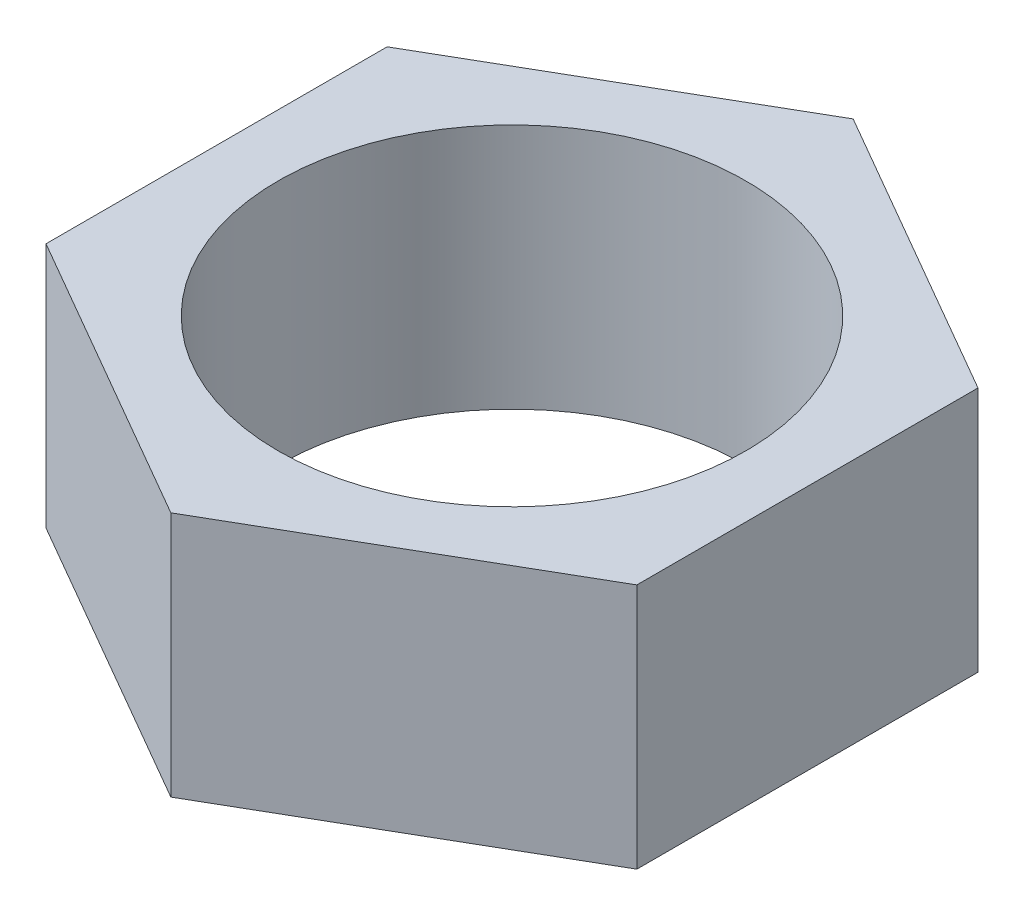
ISO-10303-21;
HEADER;
FILE_DESCRIPTION(('STEP AP214'),'2;1');
FILE_NAME('part.step','',(''),(''),'','','');
FILE_SCHEMA(('AUTOMOTIVE_DESIGN { 1 0 10303 214 1 1 1 1 }'));
ENDSEC;
DATA;
#1=APPLICATION_CONTEXT('core data for automotive mechanical design processes');
#2=APPLICATION_PROTOCOL_DEFINITION('international standard','automotive_design',2000,#1);
#3=PRODUCT_CONTEXT('',#1,'mechanical');
#4=PRODUCT('Part','Part','',(#3));
#5=PRODUCT_RELATED_PRODUCT_CATEGORY('part','',(#4));
#6=PRODUCT_DEFINITION_FORMATION('','',#4);
#7=PRODUCT_DEFINITION_CONTEXT('part definition',#1,'design');
#8=PRODUCT_DEFINITION('design','',#6,#7);
#9=PRODUCT_DEFINITION_SHAPE('','',#8);
#10=(LENGTH_UNIT() NAMED_UNIT(*) SI_UNIT(.MILLI.,.METRE.));
#11=(NAMED_UNIT(*) PLANE_ANGLE_UNIT() SI_UNIT($,.RADIAN.));
#12=(NAMED_UNIT(*) SI_UNIT($,.STERADIAN.) SOLID_ANGLE_UNIT());
#13=UNCERTAINTY_MEASURE_WITH_UNIT(LENGTH_MEASURE(1.E-05),#10,'distance_accuracy_value','');
#14=(GEOMETRIC_REPRESENTATION_CONTEXT(3) GLOBAL_UNCERTAINTY_ASSIGNED_CONTEXT((#13)) GLOBAL_UNIT_ASSIGNED_CONTEXT((#10,
#11,#12)) REPRESENTATION_CONTEXT('',''));
#15=CARTESIAN_POINT('',(0.,0.,0.));
#16=DIRECTION('',(0.,0.,1.));
#17=DIRECTION('',(1.,0.,0.));
#18=AXIS2_PLACEMENT_3D('',#15,#16,#17);
#19=CARTESIAN_POINT('',(0.,2.54,0.));
#20=DIRECTION('',(0.,1.,0.));
#21=DIRECTION('',(0.,0.,1.));
#22=AXIS2_PLACEMENT_3D('',#19,#20,#21);
#23=PLANE('',#22);
#24=DIRECTION('',(-0.866025403784438,0.,0.5));
#25=VECTOR('',#24,1.);
#26=CARTESIAN_POINT('',(0.,2.54,-3.51952724097996));
#27=LINE('',#26,#25);
#28=CARTESIAN_POINT('',(0.,2.54,-3.51952724097996));
#29=VERTEX_POINT('',#28);
#30=CARTESIAN_POINT('',(-3.048,2.54,-1.75976362048998));
#31=VERTEX_POINT('',#30);
#32=EDGE_CURVE('E129',#29,#31,#27,.T.);
#33=ORIENTED_EDGE('',*,*,#32,.T.);
#34=DIRECTION('',(0.,0.,1.));
#35=VECTOR('',#34,1.);
#36=CARTESIAN_POINT('',(-3.048,2.54,-1.75976362048998));
#37=LINE('',#36,#35);
#38=CARTESIAN_POINT('',(-3.048,2.54,1.75976362048998));
#39=VERTEX_POINT('',#38);
#40=EDGE_CURVE('E87',#31,#39,#37,.T.);
#41=ORIENTED_EDGE('',*,*,#40,.T.);
#42=DIRECTION('',(0.866025403784439,0.,0.5));
#43=VECTOR('',#42,1.);
#44=CARTESIAN_POINT('',(-3.048,2.54,1.75976362048998));
#45=LINE('',#44,#43);
#46=CARTESIAN_POINT('',(0.,2.54,3.51952724097996));
#47=VERTEX_POINT('',#46);
#48=EDGE_CURVE('E100',#39,#47,#45,.T.);
#49=ORIENTED_EDGE('',*,*,#48,.T.);
#50=DIRECTION('',(0.866025403784438,0.,-0.5));
#51=VECTOR('',#50,1.);
#52=CARTESIAN_POINT('',(0.,2.54,3.51952724097996));
#53=LINE('',#52,#51);
#54=CARTESIAN_POINT('',(3.048,2.54,1.75976362048998));
#55=VERTEX_POINT('',#54);
#56=EDGE_CURVE('E94',#47,#55,#53,.T.);
#57=ORIENTED_EDGE('',*,*,#56,.T.);
#58=DIRECTION('',(0.,0.,-1.));
#59=VECTOR('',#58,1.);
#60=CARTESIAN_POINT('',(3.048,2.54,1.75976362048998));
#61=LINE('',#60,#59);
#62=CARTESIAN_POINT('',(3.048,2.54,-1.75976362048998));
#63=VERTEX_POINT('',#62);
#64=EDGE_CURVE('E98',#55,#63,#61,.T.);
#65=ORIENTED_EDGE('',*,*,#64,.T.);
#66=DIRECTION('',(-0.866025403784439,0.,-0.5));
#67=VECTOR('',#66,1.);
#68=CARTESIAN_POINT('',(3.048,2.54,-1.75976362048998));
#69=LINE('',#68,#67);
#70=EDGE_CURVE('E50',#63,#29,#69,.T.);
#71=ORIENTED_EDGE('',*,*,#70,.T.);
#72=EDGE_LOOP('',(#33,#41,#49,#57,#65,#71));
#73=FACE_BOUND('',#72,.T.);
#74=CARTESIAN_POINT('',(0.,2.54,0.));
#75=DIRECTION('',(0.,1.,0.));
#76=DIRECTION('',(0.,0.,1.));
#77=AXIS2_PLACEMENT_3D('',#74,#75,#76);
#78=CIRCLE('',#77,2.413);
#79=CARTESIAN_POINT('',(0.,2.54,2.413));
#80=VERTEX_POINT('',#79);
#81=EDGE_CURVE('E122',#80,#80,#78,.T.);
#82=ORIENTED_EDGE('',*,*,#81,.F.);
#83=EDGE_LOOP('',(#82));
#84=FACE_BOUND('',#83,.T.);
#85=ADVANCED_FACE('F33',(#73,#84),#23,.T.);
#86=CARTESIAN_POINT('',(0.,0.,0.));
#87=DIRECTION('',(0.,1.,0.));
#88=DIRECTION('',(0.,0.,1.));
#89=AXIS2_PLACEMENT_3D('',#86,#87,#88);
#90=PLANE('',#89);
#91=DIRECTION('',(-0.866025403784438,0.,0.5));
#92=VECTOR('',#91,1.);
#93=CARTESIAN_POINT('',(0.,0.,-3.51952724097996));
#94=LINE('',#93,#92);
#95=CARTESIAN_POINT('',(0.,0.,-3.51952724097996));
#96=VERTEX_POINT('',#95);
#97=CARTESIAN_POINT('',(-3.048,0.,-1.75976362048998));
#98=VERTEX_POINT('',#97);
#99=EDGE_CURVE('E118',#96,#98,#94,.T.);
#100=ORIENTED_EDGE('',*,*,#99,.F.);
#101=DIRECTION('',(-0.866025403784439,0.,-0.5));
#102=VECTOR('',#101,1.);
#103=CARTESIAN_POINT('',(3.048,0.,-1.75976362048998));
#104=LINE('',#103,#102);
#105=CARTESIAN_POINT('',(3.048,0.,-1.75976362048998));
#106=VERTEX_POINT('',#105);
#107=EDGE_CURVE('E79',#106,#96,#104,.T.);
#108=ORIENTED_EDGE('',*,*,#107,.F.);
#109=DIRECTION('',(0.,0.,-1.));
#110=VECTOR('',#109,1.);
#111=CARTESIAN_POINT('',(3.048,0.,1.75976362048998));
#112=LINE('',#111,#110);
#113=CARTESIAN_POINT('',(3.048,0.,1.75976362048998));
#114=VERTEX_POINT('',#113);
#115=EDGE_CURVE('E73',#114,#106,#112,.T.);
#116=ORIENTED_EDGE('',*,*,#115,.F.);
#117=DIRECTION('',(0.866025403784438,0.,-0.5));
#118=VECTOR('',#117,1.);
#119=CARTESIAN_POINT('',(0.,0.,3.51952724097996));
#120=LINE('',#119,#118);
#121=CARTESIAN_POINT('',(0.,0.,3.51952724097996));
#122=VERTEX_POINT('',#121);
#123=EDGE_CURVE('E108',#122,#114,#120,.T.);
#124=ORIENTED_EDGE('',*,*,#123,.F.);
#125=DIRECTION('',(0.866025403784439,0.,0.5));
#126=VECTOR('',#125,1.);
#127=CARTESIAN_POINT('',(-3.048,0.,1.75976362048998));
#128=LINE('',#127,#126);
#129=CARTESIAN_POINT('',(-3.048,0.,1.75976362048998));
#130=VERTEX_POINT('',#129);
#131=EDGE_CURVE('E124',#130,#122,#128,.T.);
#132=ORIENTED_EDGE('',*,*,#131,.F.);
#133=DIRECTION('',(0.,0.,1.));
#134=VECTOR('',#133,1.);
#135=CARTESIAN_POINT('',(-3.048,0.,-1.75976362048998));
#136=LINE('',#135,#134);
#137=EDGE_CURVE('E121',#98,#130,#136,.T.);
#138=ORIENTED_EDGE('',*,*,#137,.F.);
#139=EDGE_LOOP('',(#100,#108,#116,#124,#132,#138));
#140=FACE_BOUND('',#139,.T.);
#141=CARTESIAN_POINT('',(0.,0.,0.));
#142=DIRECTION('',(0.,1.,0.));
#143=DIRECTION('',(0.,0.,1.));
#144=AXIS2_PLACEMENT_3D('',#141,#142,#143);
#145=CIRCLE('',#144,2.413);
#146=CARTESIAN_POINT('',(0.,0.,2.413));
#147=VERTEX_POINT('',#146);
#148=EDGE_CURVE('E222',#147,#147,#145,.T.);
#149=ORIENTED_EDGE('',*,*,#148,.T.);
#150=EDGE_LOOP('',(#149));
#151=FACE_BOUND('',#150,.T.);
#152=ADVANCED_FACE('F138',(#140,#151),#90,.F.);
#153=CARTESIAN_POINT('',(0.,2.54,-3.51952724097996));
#154=DIRECTION('',(0.5,0.,0.866025403784438));
#155=DIRECTION('',(0.866025403784439,0.,-0.5));
#156=AXIS2_PLACEMENT_3D('',#153,#154,#155);
#157=PLANE('',#156);
#158=ORIENTED_EDGE('',*,*,#99,.T.);
#159=DIRECTION('',(0.,-1.,0.));
#160=VECTOR('',#159,1.);
#161=CARTESIAN_POINT('',(-3.048,2.54,-1.75976362048998));
#162=LINE('',#161,#160);
#163=EDGE_CURVE('E11',#31,#98,#162,.T.);
#164=ORIENTED_EDGE('',*,*,#163,.F.);
#165=ORIENTED_EDGE('',*,*,#32,.F.);
#166=DIRECTION('',(0.,-1.,0.));
#167=VECTOR('',#166,1.);
#168=CARTESIAN_POINT('',(0.,2.54,-3.51952724097996));
#169=LINE('',#168,#167);
#170=EDGE_CURVE('E114',#29,#96,#169,.T.);
#171=ORIENTED_EDGE('',*,*,#170,.T.);
#172=EDGE_LOOP('',(#158,#164,#165,#171));
#173=FACE_BOUND('',#172,.T.);
#174=ADVANCED_FACE('F35',(#173),#157,.F.);
#175=CARTESIAN_POINT('',(-3.048,2.54,-1.75976362048998));
#176=DIRECTION('',(1.,0.,0.));
#177=DIRECTION('',(0.,0.,-1.));
#178=AXIS2_PLACEMENT_3D('',#175,#176,#177);
#179=PLANE('',#178);
#180=ORIENTED_EDGE('',*,*,#137,.T.);
#181=DIRECTION('',(0.,-1.,0.));
#182=VECTOR('',#181,1.);
#183=CARTESIAN_POINT('',(-3.048,2.54,1.75976362048998));
#184=LINE('',#183,#182);
#185=EDGE_CURVE('E42',#39,#130,#184,.T.);
#186=ORIENTED_EDGE('',*,*,#185,.F.);
#187=ORIENTED_EDGE('',*,*,#40,.F.);
#188=ORIENTED_EDGE('',*,*,#163,.T.);
#189=EDGE_LOOP('',(#180,#186,#187,#188));
#190=FACE_BOUND('',#189,.T.);
#191=ADVANCED_FACE('F163',(#190),#179,.F.);
#192=CARTESIAN_POINT('',(-3.048,2.54,1.75976362048998));
#193=DIRECTION('',(0.5,0.,-0.866025403784439));
#194=DIRECTION('',(-0.866025403784439,0.,-0.5));
#195=AXIS2_PLACEMENT_3D('',#192,#193,#194);
#196=PLANE('',#195);
#197=ORIENTED_EDGE('',*,*,#131,.T.);
#198=DIRECTION('',(0.,-1.,0.));
#199=VECTOR('',#198,1.);
#200=CARTESIAN_POINT('',(0.,2.54,3.51952724097996));
#201=LINE('',#200,#199);
#202=EDGE_CURVE('E109',#47,#122,#201,.T.);
#203=ORIENTED_EDGE('',*,*,#202,.F.);
#204=ORIENTED_EDGE('',*,*,#48,.F.);
#205=ORIENTED_EDGE('',*,*,#185,.T.);
#206=EDGE_LOOP('',(#197,#203,#204,#205));
#207=FACE_BOUND('',#206,.T.);
#208=ADVANCED_FACE('F135',(#207),#196,.F.);
#209=CARTESIAN_POINT('',(0.,2.54,3.51952724097996));
#210=DIRECTION('',(-0.5,0.,-0.866025403784438));
#211=DIRECTION('',(-0.866025403784439,0.,0.5));
#212=AXIS2_PLACEMENT_3D('',#209,#210,#211);
#213=PLANE('',#212);
#214=ORIENTED_EDGE('',*,*,#123,.T.);
#215=DIRECTION('',(0.,-1.,0.));
#216=VECTOR('',#215,1.);
#217=CARTESIAN_POINT('',(3.048,2.54,1.75976362048998));
#218=LINE('',#217,#216);
#219=EDGE_CURVE('E105',#55,#114,#218,.T.);
#220=ORIENTED_EDGE('',*,*,#219,.F.);
#221=ORIENTED_EDGE('',*,*,#56,.F.);
#222=ORIENTED_EDGE('',*,*,#202,.T.);
#223=EDGE_LOOP('',(#214,#220,#221,#222));
#224=FACE_BOUND('',#223,.T.);
#225=ADVANCED_FACE('F106',(#224),#213,.F.);
#226=CARTESIAN_POINT('',(3.048,2.54,1.75976362048998));
#227=DIRECTION('',(-1.,0.,0.));
#228=DIRECTION('',(0.,0.,1.));
#229=AXIS2_PLACEMENT_3D('',#226,#227,#228);
#230=PLANE('',#229);
#231=ORIENTED_EDGE('',*,*,#115,.T.);
#232=DIRECTION('',(0.,-1.,0.));
#233=VECTOR('',#232,1.);
#234=CARTESIAN_POINT('',(3.048,2.54,-1.75976362048998));
#235=LINE('',#234,#233);
#236=EDGE_CURVE('E110',#63,#106,#235,.T.);
#237=ORIENTED_EDGE('',*,*,#236,.F.);
#238=ORIENTED_EDGE('',*,*,#64,.F.);
#239=ORIENTED_EDGE('',*,*,#219,.T.);
#240=EDGE_LOOP('',(#231,#237,#238,#239));
#241=FACE_BOUND('',#240,.T.);
#242=ADVANCED_FACE('F112',(#241),#230,.F.);
#243=CARTESIAN_POINT('',(3.048,2.54,-1.75976362048998));
#244=DIRECTION('',(-0.5,0.,0.866025403784439));
#245=DIRECTION('',(0.866025403784439,0.,0.5));
#246=AXIS2_PLACEMENT_3D('',#243,#244,#245);
#247=PLANE('',#246);
#248=ORIENTED_EDGE('',*,*,#107,.T.);
#249=ORIENTED_EDGE('',*,*,#170,.F.);
#250=ORIENTED_EDGE('',*,*,#70,.F.);
#251=ORIENTED_EDGE('',*,*,#236,.T.);
#252=EDGE_LOOP('',(#248,#249,#250,#251));
#253=FACE_BOUND('',#252,.T.);
#254=ADVANCED_FACE('F143',(#253),#247,.F.);
#255=CARTESIAN_POINT('',(0.,2.54,0.));
#256=DIRECTION('',(0.,-1.,0.));
#257=DIRECTION('',(0.,0.,-1.));
#258=AXIS2_PLACEMENT_3D('',#255,#256,#257);
#259=CYLINDRICAL_SURFACE('',#258,2.413);
#260=ORIENTED_EDGE('',*,*,#81,.T.);
#261=EDGE_LOOP('',(#260));
#262=FACE_BOUND('',#261,.T.);
#263=ORIENTED_EDGE('',*,*,#148,.F.);
#264=EDGE_LOOP('',(#263));
#265=FACE_BOUND('',#264,.T.);
#266=ADVANCED_FACE('F145',(#262,#265),#259,.F.);
#267=CLOSED_SHELL('',(#85,#152,#174,#191,#208,#225,#242,#254,#266));
#268=MANIFOLD_SOLID_BREP('B2',#267);
#269=ADVANCED_BREP_SHAPE_REPRESENTATION('',(#18,#268),#14);
#270=SHAPE_DEFINITION_REPRESENTATION(#9,#269);
ENDSEC;
END-ISO-10303-21;
